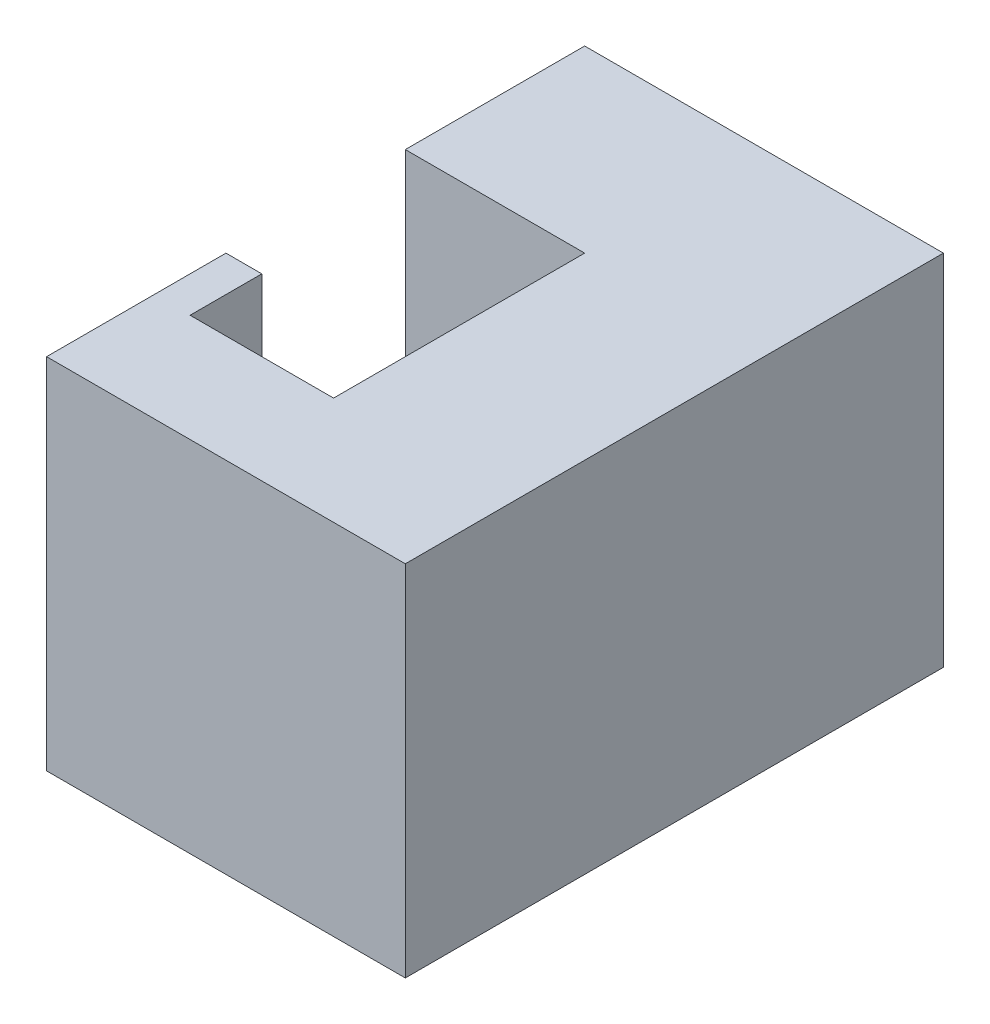
ISO-10303-21;
HEADER;
FILE_DESCRIPTION(('STEP AP214'),'2;1');
FILE_NAME('part.step','',(''),(''),'','','');
FILE_SCHEMA(('AUTOMOTIVE_DESIGN { 1 0 10303 214 1 1 1 1 }'));
ENDSEC;
DATA;
#1=APPLICATION_CONTEXT('core data for automotive mechanical design processes');
#2=APPLICATION_PROTOCOL_DEFINITION('international standard','automotive_design',2000,#1);
#3=PRODUCT_CONTEXT('',#1,'mechanical');
#4=PRODUCT('Part','Part','',(#3));
#5=PRODUCT_RELATED_PRODUCT_CATEGORY('part','',(#4));
#6=PRODUCT_DEFINITION_FORMATION('','',#4);
#7=PRODUCT_DEFINITION_CONTEXT('part definition',#1,'design');
#8=PRODUCT_DEFINITION('design','',#6,#7);
#9=PRODUCT_DEFINITION_SHAPE('','',#8);
#10=(LENGTH_UNIT() NAMED_UNIT(*) SI_UNIT(.MILLI.,.METRE.));
#11=(NAMED_UNIT(*) PLANE_ANGLE_UNIT() SI_UNIT($,.RADIAN.));
#12=(NAMED_UNIT(*) SI_UNIT($,.STERADIAN.) SOLID_ANGLE_UNIT());
#13=UNCERTAINTY_MEASURE_WITH_UNIT(LENGTH_MEASURE(1.E-05),#10,'distance_accuracy_value','');
#14=(GEOMETRIC_REPRESENTATION_CONTEXT(3) GLOBAL_UNCERTAINTY_ASSIGNED_CONTEXT((#13)) GLOBAL_UNIT_ASSIGNED_CONTEXT((#10,
#11,#12)) REPRESENTATION_CONTEXT('',''));
#15=CARTESIAN_POINT('',(0.,0.,0.));
#16=DIRECTION('',(0.,0.,1.));
#17=DIRECTION('',(1.,0.,0.));
#18=AXIS2_PLACEMENT_3D('',#15,#16,#17);
#19=CARTESIAN_POINT('',(-2.5,5.,3.75));
#20=DIRECTION('',(1.,0.,0.));
#21=DIRECTION('',(0.,0.,-1.));
#22=AXIS2_PLACEMENT_3D('',#19,#20,#21);
#23=PLANE('',#22);
#24=DIRECTION('',(0.,1.,0.));
#25=VECTOR('',#24,1.);
#26=CARTESIAN_POINT('',(-2.5,-12.8847050800552,1.25));
#27=LINE('',#26,#25);
#28=CARTESIAN_POINT('',(-2.5,0.,1.25));
#29=VERTEX_POINT('',#28);
#30=CARTESIAN_POINT('',(-2.5,5.,1.25));
#31=VERTEX_POINT('',#30);
#32=EDGE_CURVE('E171',#29,#31,#27,.T.);
#33=ORIENTED_EDGE('',*,*,#32,.F.);
#34=DIRECTION('',(0.,0.,1.));
#35=VECTOR('',#34,1.);
#36=CARTESIAN_POINT('',(-2.5,0.,3.75));
#37=LINE('',#36,#35);
#38=CARTESIAN_POINT('',(-2.5,0.,3.75));
#39=VERTEX_POINT('',#38);
#40=EDGE_CURVE('E200',#29,#39,#37,.T.);
#41=ORIENTED_EDGE('',*,*,#40,.T.);
#42=DIRECTION('',(0.,-1.,0.));
#43=VECTOR('',#42,1.);
#44=CARTESIAN_POINT('',(-2.5,5.,3.75));
#45=LINE('',#44,#43);
#46=CARTESIAN_POINT('',(-2.5,5.,3.75));
#47=VERTEX_POINT('',#46);
#48=EDGE_CURVE('E209',#47,#39,#45,.T.);
#49=ORIENTED_EDGE('',*,*,#48,.F.);
#50=DIRECTION('',(0.,0.,1.));
#51=VECTOR('',#50,1.);
#52=CARTESIAN_POINT('',(-2.5,5.,3.75));
#53=LINE('',#52,#51);
#54=EDGE_CURVE('E187',#31,#47,#53,.T.);
#55=ORIENTED_EDGE('',*,*,#54,.F.);
#56=EDGE_LOOP('',(#33,#41,#49,#55));
#57=FACE_BOUND('',#56,.T.);
#58=ADVANCED_FACE('F39',(#57),#23,.F.);
#59=DIRECTION('',(0.,1.,0.));
#60=VECTOR('',#59,1.);
#61=CARTESIAN_POINT('',(-2.5,-12.8847050800552,-1.25));
#62=LINE('',#61,#60);
#63=CARTESIAN_POINT('',(-2.5,0.,-1.25));
#64=VERTEX_POINT('',#63);
#65=CARTESIAN_POINT('',(-2.5,5.,-1.25));
#66=VERTEX_POINT('',#65);
#67=EDGE_CURVE('E55',#64,#66,#62,.T.);
#68=ORIENTED_EDGE('',*,*,#67,.T.);
#69=CARTESIAN_POINT('',(-2.5,5.,-3.75));
#70=VERTEX_POINT('',#69);
#71=EDGE_CURVE('E147',#70,#66,#53,.T.);
#72=ORIENTED_EDGE('',*,*,#71,.F.);
#73=DIRECTION('',(0.,-1.,0.));
#74=VECTOR('',#73,1.);
#75=CARTESIAN_POINT('',(-2.5,5.,-3.75));
#76=LINE('',#75,#74);
#77=CARTESIAN_POINT('',(-2.5,0.,-3.75));
#78=VERTEX_POINT('',#77);
#79=EDGE_CURVE('E48',#70,#78,#76,.T.);
#80=ORIENTED_EDGE('',*,*,#79,.T.);
#81=EDGE_CURVE('E201',#78,#64,#37,.T.);
#82=ORIENTED_EDGE('',*,*,#81,.T.);
#83=EDGE_LOOP('',(#68,#72,#80,#82));
#84=FACE_BOUND('',#83,.T.);
#85=ADVANCED_FACE('F215',(#84),#23,.F.);
#86=CARTESIAN_POINT('',(0.,0.,0.));
#87=DIRECTION('',(0.,-1.,0.));
#88=DIRECTION('',(0.,0.,-1.));
#89=AXIS2_PLACEMENT_3D('',#86,#87,#88);
#90=PLANE('',#89);
#91=ORIENTED_EDGE('',*,*,#40,.F.);
#92=DIRECTION('',(-1.,0.,0.));
#93=VECTOR('',#92,1.);
#94=CARTESIAN_POINT('',(-2.,0.,1.25));
#95=LINE('',#94,#93);
#96=CARTESIAN_POINT('',(-2.,0.,1.25));
#97=VERTEX_POINT('',#96);
#98=EDGE_CURVE('E178',#97,#29,#95,.T.);
#99=ORIENTED_EDGE('',*,*,#98,.F.);
#100=DIRECTION('',(0.,0.,-1.));
#101=VECTOR('',#100,1.);
#102=CARTESIAN_POINT('',(-2.,0.,2.25));
#103=LINE('',#102,#101);
#104=CARTESIAN_POINT('',(-2.,0.,2.25));
#105=VERTEX_POINT('',#104);
#106=EDGE_CURVE('E181',#105,#97,#103,.T.);
#107=ORIENTED_EDGE('',*,*,#106,.F.);
#108=DIRECTION('',(-1.,0.,0.));
#109=VECTOR('',#108,1.);
#110=CARTESIAN_POINT('',(0.,0.,2.25));
#111=LINE('',#110,#109);
#112=CARTESIAN_POINT('',(0.,0.,2.25));
#113=VERTEX_POINT('',#112);
#114=EDGE_CURVE('E224',#113,#105,#111,.T.);
#115=ORIENTED_EDGE('',*,*,#114,.F.);
#116=DIRECTION('',(0.,0.,1.));
#117=VECTOR('',#116,1.);
#118=CARTESIAN_POINT('',(0.,0.,-1.25));
#119=LINE('',#118,#117);
#120=CARTESIAN_POINT('',(0.,0.,-1.25));
#121=VERTEX_POINT('',#120);
#122=EDGE_CURVE('E221',#121,#113,#119,.T.);
#123=ORIENTED_EDGE('',*,*,#122,.F.);
#124=DIRECTION('',(1.,0.,0.));
#125=VECTOR('',#124,1.);
#126=CARTESIAN_POINT('',(-2.5,0.,-1.25));
#127=LINE('',#126,#125);
#128=EDGE_CURVE('E141',#64,#121,#127,.T.);
#129=ORIENTED_EDGE('',*,*,#128,.F.);
#130=ORIENTED_EDGE('',*,*,#81,.F.);
#131=DIRECTION('',(-1.,0.,0.));
#132=VECTOR('',#131,1.);
#133=CARTESIAN_POINT('',(-2.5,0.,-3.75));
#134=LINE('',#133,#132);
#135=CARTESIAN_POINT('',(2.5,0.,-3.75));
#136=VERTEX_POINT('',#135);
#137=EDGE_CURVE('E197',#136,#78,#134,.T.);
#138=ORIENTED_EDGE('',*,*,#137,.F.);
#139=DIRECTION('',(0.,0.,-1.));
#140=VECTOR('',#139,1.);
#141=CARTESIAN_POINT('',(2.5,0.,3.75));
#142=LINE('',#141,#140);
#143=CARTESIAN_POINT('',(2.5,0.,3.75));
#144=VERTEX_POINT('',#143);
#145=EDGE_CURVE('E193',#144,#136,#142,.T.);
#146=ORIENTED_EDGE('',*,*,#145,.F.);
#147=DIRECTION('',(1.,0.,0.));
#148=VECTOR('',#147,1.);
#149=CARTESIAN_POINT('',(-2.5,0.,3.75));
#150=LINE('',#149,#148);
#151=EDGE_CURVE('E85',#39,#144,#150,.T.);
#152=ORIENTED_EDGE('',*,*,#151,.F.);
#153=EDGE_LOOP('',(#91,#99,#107,#115,#123,#129,#130,#138,#146,#152));
#154=FACE_BOUND('',#153,.T.);
#155=ADVANCED_FACE('F218',(#154),#90,.T.);
#156=CARTESIAN_POINT('',(2.5,5.,3.75));
#157=DIRECTION('',(-1.,0.,0.));
#158=DIRECTION('',(0.,0.,1.));
#159=AXIS2_PLACEMENT_3D('',#156,#157,#158);
#160=PLANE('',#159);
#161=ORIENTED_EDGE('',*,*,#145,.T.);
#162=DIRECTION('',(0.,-1.,0.));
#163=VECTOR('',#162,1.);
#164=CARTESIAN_POINT('',(2.5,5.,-3.75));
#165=LINE('',#164,#163);
#166=CARTESIAN_POINT('',(2.5,5.,-3.75));
#167=VERTEX_POINT('',#166);
#168=EDGE_CURVE('E11',#167,#136,#165,.T.);
#169=ORIENTED_EDGE('',*,*,#168,.F.);
#170=DIRECTION('',(0.,0.,-1.));
#171=VECTOR('',#170,1.);
#172=CARTESIAN_POINT('',(2.5,5.,3.75));
#173=LINE('',#172,#171);
#174=CARTESIAN_POINT('',(2.5,5.,3.75));
#175=VERTEX_POINT('',#174);
#176=EDGE_CURVE('E182',#175,#167,#173,.T.);
#177=ORIENTED_EDGE('',*,*,#176,.F.);
#178=DIRECTION('',(0.,-1.,0.));
#179=VECTOR('',#178,1.);
#180=CARTESIAN_POINT('',(2.5,5.,3.75));
#181=LINE('',#180,#179);
#182=EDGE_CURVE('E192',#175,#144,#181,.T.);
#183=ORIENTED_EDGE('',*,*,#182,.T.);
#184=EDGE_LOOP('',(#161,#169,#177,#183));
#185=FACE_BOUND('',#184,.T.);
#186=ADVANCED_FACE('F41',(#185),#160,.F.);
#187=CARTESIAN_POINT('',(-2.5,5.,-3.75));
#188=DIRECTION('',(0.,0.,1.));
#189=DIRECTION('',(1.,0.,0.));
#190=AXIS2_PLACEMENT_3D('',#187,#188,#189);
#191=PLANE('',#190);
#192=ORIENTED_EDGE('',*,*,#137,.T.);
#193=ORIENTED_EDGE('',*,*,#79,.F.);
#194=DIRECTION('',(-1.,0.,0.));
#195=VECTOR('',#194,1.);
#196=CARTESIAN_POINT('',(-2.5,5.,-3.75));
#197=LINE('',#196,#195);
#198=EDGE_CURVE('E92',#167,#70,#197,.T.);
#199=ORIENTED_EDGE('',*,*,#198,.F.);
#200=ORIENTED_EDGE('',*,*,#168,.T.);
#201=EDGE_LOOP('',(#192,#193,#199,#200));
#202=FACE_BOUND('',#201,.T.);
#203=ADVANCED_FACE('F247',(#202),#191,.F.);
#204=CARTESIAN_POINT('',(-2.5,5.,3.75));
#205=DIRECTION('',(0.,0.,-1.));
#206=DIRECTION('',(-1.,0.,0.));
#207=AXIS2_PLACEMENT_3D('',#204,#205,#206);
#208=PLANE('',#207);
#209=ORIENTED_EDGE('',*,*,#151,.T.);
#210=ORIENTED_EDGE('',*,*,#182,.F.);
#211=DIRECTION('',(1.,0.,0.));
#212=VECTOR('',#211,1.);
#213=CARTESIAN_POINT('',(-2.5,5.,3.75));
#214=LINE('',#213,#212);
#215=EDGE_CURVE('E64',#47,#175,#214,.T.);
#216=ORIENTED_EDGE('',*,*,#215,.F.);
#217=ORIENTED_EDGE('',*,*,#48,.T.);
#218=EDGE_LOOP('',(#209,#210,#216,#217));
#219=FACE_BOUND('',#218,.T.);
#220=ADVANCED_FACE('F243',(#219),#208,.F.);
#221=CARTESIAN_POINT('',(0.,5.,0.));
#222=DIRECTION('',(0.,-1.,0.));
#223=DIRECTION('',(0.,0.,-1.));
#224=AXIS2_PLACEMENT_3D('',#221,#222,#223);
#225=PLANE('',#224);
#226=ORIENTED_EDGE('',*,*,#71,.T.);
#227=DIRECTION('',(1.,0.,0.));
#228=VECTOR('',#227,1.);
#229=CARTESIAN_POINT('',(-2.5,5.,-1.25));
#230=LINE('',#229,#228);
#231=CARTESIAN_POINT('',(0.,5.,-1.25));
#232=VERTEX_POINT('',#231);
#233=EDGE_CURVE('E138',#66,#232,#230,.T.);
#234=ORIENTED_EDGE('',*,*,#233,.T.);
#235=DIRECTION('',(0.,0.,1.));
#236=VECTOR('',#235,1.);
#237=CARTESIAN_POINT('',(0.,5.,-1.25));
#238=LINE('',#237,#236);
#239=CARTESIAN_POINT('',(0.,5.,2.25));
#240=VERTEX_POINT('',#239);
#241=EDGE_CURVE('E127',#232,#240,#238,.T.);
#242=ORIENTED_EDGE('',*,*,#241,.T.);
#243=DIRECTION('',(-1.,0.,0.));
#244=VECTOR('',#243,1.);
#245=CARTESIAN_POINT('',(0.,5.,2.25));
#246=LINE('',#245,#244);
#247=CARTESIAN_POINT('',(-2.,5.,2.25));
#248=VERTEX_POINT('',#247);
#249=EDGE_CURVE('E137',#240,#248,#246,.T.);
#250=ORIENTED_EDGE('',*,*,#249,.T.);
#251=DIRECTION('',(0.,0.,-1.));
#252=VECTOR('',#251,1.);
#253=CARTESIAN_POINT('',(-2.,5.,2.25));
#254=LINE('',#253,#252);
#255=CARTESIAN_POINT('',(-2.,5.,1.25));
#256=VERTEX_POINT('',#255);
#257=EDGE_CURVE('E155',#248,#256,#254,.T.);
#258=ORIENTED_EDGE('',*,*,#257,.T.);
#259=DIRECTION('',(-1.,0.,0.));
#260=VECTOR('',#259,1.);
#261=CARTESIAN_POINT('',(-2.,5.,1.25));
#262=LINE('',#261,#260);
#263=EDGE_CURVE('E159',#256,#31,#262,.T.);
#264=ORIENTED_EDGE('',*,*,#263,.T.);
#265=ORIENTED_EDGE('',*,*,#54,.T.);
#266=ORIENTED_EDGE('',*,*,#215,.T.);
#267=ORIENTED_EDGE('',*,*,#176,.T.);
#268=ORIENTED_EDGE('',*,*,#198,.T.);
#269=EDGE_LOOP('',(#226,#234,#242,#250,#258,#264,#265,#266,#267,#268));
#270=FACE_BOUND('',#269,.T.);
#271=ADVANCED_FACE('F145',(#270),#225,.F.);
#272=CARTESIAN_POINT('',(-2.,-12.8847050800552,1.25));
#273=DIRECTION('',(0.,0.,-1.));
#274=DIRECTION('',(-1.,0.,0.));
#275=AXIS2_PLACEMENT_3D('',#272,#273,#274);
#276=PLANE('',#275);
#277=DIRECTION('',(0.,1.,0.));
#278=VECTOR('',#277,1.);
#279=CARTESIAN_POINT('',(-2.,-12.8847050800552,1.25));
#280=LINE('',#279,#278);
#281=EDGE_CURVE('E174',#97,#256,#280,.T.);
#282=ORIENTED_EDGE('',*,*,#281,.F.);
#283=ORIENTED_EDGE('',*,*,#98,.T.);
#284=ORIENTED_EDGE('',*,*,#32,.T.);
#285=ORIENTED_EDGE('',*,*,#263,.F.);
#286=EDGE_LOOP('',(#282,#283,#284,#285));
#287=FACE_BOUND('',#286,.T.);
#288=ADVANCED_FACE('F236',(#287),#276,.T.);
#289=CARTESIAN_POINT('',(-2.,-12.8847050800552,2.25));
#290=DIRECTION('',(1.,0.,0.));
#291=DIRECTION('',(0.,0.,-1.));
#292=AXIS2_PLACEMENT_3D('',#289,#290,#291);
#293=PLANE('',#292);
#294=DIRECTION('',(0.,1.,0.));
#295=VECTOR('',#294,1.);
#296=CARTESIAN_POINT('',(-2.,-12.8847050800552,2.25));
#297=LINE('',#296,#295);
#298=EDGE_CURVE('E167',#105,#248,#297,.T.);
#299=ORIENTED_EDGE('',*,*,#298,.F.);
#300=ORIENTED_EDGE('',*,*,#106,.T.);
#301=ORIENTED_EDGE('',*,*,#281,.T.);
#302=ORIENTED_EDGE('',*,*,#257,.F.);
#303=EDGE_LOOP('',(#299,#300,#301,#302));
#304=FACE_BOUND('',#303,.T.);
#305=ADVANCED_FACE('F233',(#304),#293,.T.);
#306=CARTESIAN_POINT('',(0.,-12.8847050800552,2.25));
#307=DIRECTION('',(0.,0.,-1.));
#308=DIRECTION('',(-1.,0.,0.));
#309=AXIS2_PLACEMENT_3D('',#306,#307,#308);
#310=PLANE('',#309);
#311=DIRECTION('',(0.,1.,0.));
#312=VECTOR('',#311,1.);
#313=CARTESIAN_POINT('',(0.,-12.8847050800552,2.25));
#314=LINE('',#313,#312);
#315=EDGE_CURVE('E133',#113,#240,#314,.T.);
#316=ORIENTED_EDGE('',*,*,#315,.F.);
#317=ORIENTED_EDGE('',*,*,#114,.T.);
#318=ORIENTED_EDGE('',*,*,#298,.T.);
#319=ORIENTED_EDGE('',*,*,#249,.F.);
#320=EDGE_LOOP('',(#316,#317,#318,#319));
#321=FACE_BOUND('',#320,.T.);
#322=ADVANCED_FACE('F268',(#321),#310,.T.);
#323=CARTESIAN_POINT('',(0.,-12.8847050800552,-1.25));
#324=DIRECTION('',(-1.,0.,0.));
#325=DIRECTION('',(0.,0.,1.));
#326=AXIS2_PLACEMENT_3D('',#323,#324,#325);
#327=PLANE('',#326);
#328=DIRECTION('',(0.,1.,0.));
#329=VECTOR('',#328,1.);
#330=CARTESIAN_POINT('',(0.,-12.8847050800552,-1.25));
#331=LINE('',#330,#329);
#332=EDGE_CURVE('E130',#121,#232,#331,.T.);
#333=ORIENTED_EDGE('',*,*,#332,.F.);
#334=ORIENTED_EDGE('',*,*,#122,.T.);
#335=ORIENTED_EDGE('',*,*,#315,.T.);
#336=ORIENTED_EDGE('',*,*,#241,.F.);
#337=EDGE_LOOP('',(#333,#334,#335,#336));
#338=FACE_BOUND('',#337,.T.);
#339=ADVANCED_FACE('F129',(#338),#327,.T.);
#340=CARTESIAN_POINT('',(-2.5,-12.8847050800552,-1.25));
#341=DIRECTION('',(0.,0.,1.));
#342=DIRECTION('',(1.,0.,0.));
#343=AXIS2_PLACEMENT_3D('',#340,#341,#342);
#344=PLANE('',#343);
#345=ORIENTED_EDGE('',*,*,#67,.F.);
#346=ORIENTED_EDGE('',*,*,#128,.T.);
#347=ORIENTED_EDGE('',*,*,#332,.T.);
#348=ORIENTED_EDGE('',*,*,#233,.F.);
#349=EDGE_LOOP('',(#345,#346,#347,#348));
#350=FACE_BOUND('',#349,.T.);
#351=ADVANCED_FACE('F140',(#350),#344,.T.);
#352=CLOSED_SHELL('',(#58,#85,#155,#186,#203,#220,#271,#288,#305,#322,#339,#351));
#353=MANIFOLD_SOLID_BREP('B2',#352);
#354=ADVANCED_BREP_SHAPE_REPRESENTATION('',(#18,#353),#14);
#355=SHAPE_DEFINITION_REPRESENTATION(#9,#354);
ENDSEC;
END-ISO-10303-21;
